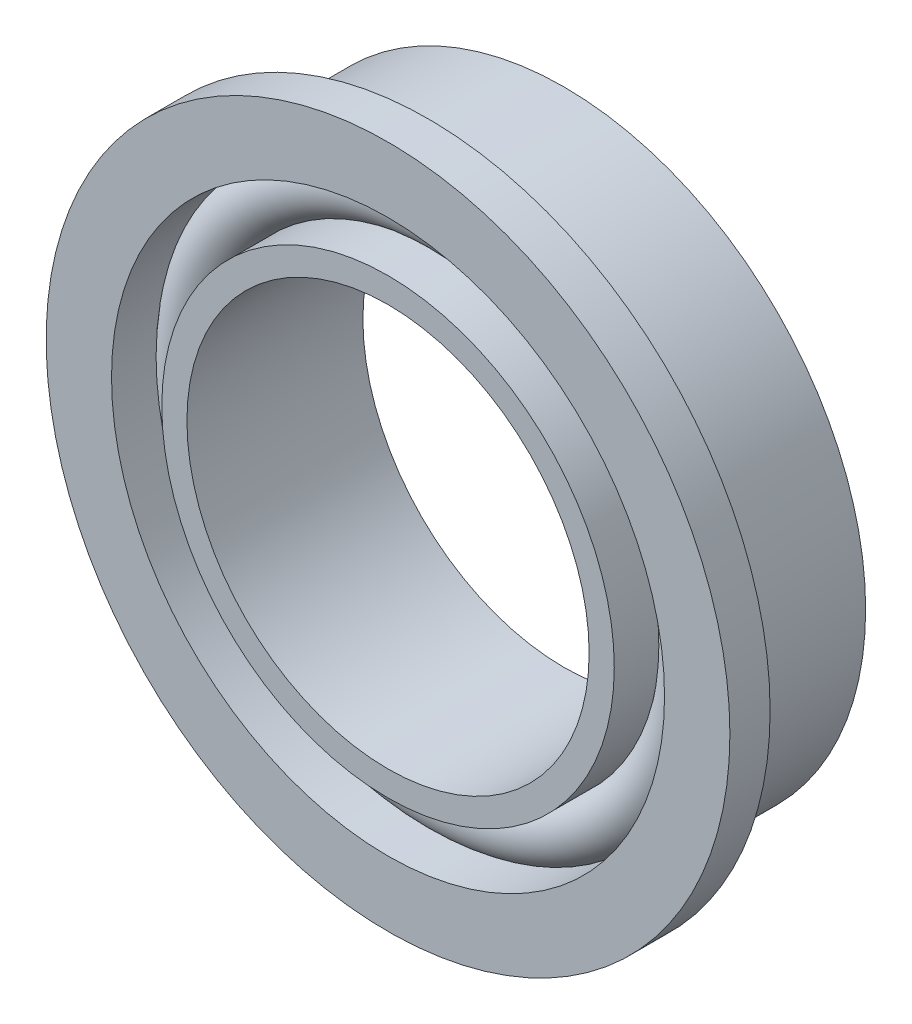
ISO-10303-21;
HEADER;
FILE_DESCRIPTION(('STEP AP214'),'2;1');
FILE_NAME('part.step','',(''),(''),'','','');
FILE_SCHEMA(('AUTOMOTIVE_DESIGN { 1 0 10303 214 1 1 1 1 }'));
ENDSEC;
DATA;
#1=APPLICATION_CONTEXT('core data for automotive mechanical design processes');
#2=APPLICATION_PROTOCOL_DEFINITION('international standard','automotive_design',2000,#1);
#3=PRODUCT_CONTEXT('',#1,'mechanical');
#4=PRODUCT('Part','Part','',(#3));
#5=PRODUCT_RELATED_PRODUCT_CATEGORY('part','',(#4));
#6=PRODUCT_DEFINITION_FORMATION('','',#4);
#7=PRODUCT_DEFINITION_CONTEXT('part definition',#1,'design');
#8=PRODUCT_DEFINITION('design','',#6,#7);
#9=PRODUCT_DEFINITION_SHAPE('','',#8);
#10=(LENGTH_UNIT() NAMED_UNIT(*) SI_UNIT(.MILLI.,.METRE.));
#11=(NAMED_UNIT(*) PLANE_ANGLE_UNIT() SI_UNIT($,.RADIAN.));
#12=(NAMED_UNIT(*) SI_UNIT($,.STERADIAN.) SOLID_ANGLE_UNIT());
#13=UNCERTAINTY_MEASURE_WITH_UNIT(LENGTH_MEASURE(1.E-05),#10,'distance_accuracy_value','');
#14=(GEOMETRIC_REPRESENTATION_CONTEXT(3) GLOBAL_UNCERTAINTY_ASSIGNED_CONTEXT((#13)) GLOBAL_UNIT_ASSIGNED_CONTEXT((#10,
#11,#12)) REPRESENTATION_CONTEXT('',''));
#15=CARTESIAN_POINT('',(0.,0.,0.));
#16=DIRECTION('',(0.,0.,1.));
#17=DIRECTION('',(1.,0.,0.));
#18=AXIS2_PLACEMENT_3D('',#15,#16,#17);
#19=CARTESIAN_POINT('',(0.,0.,3.5));
#20=DIRECTION('',(0.,0.,-1.));
#21=DIRECTION('',(-1.,0.,0.));
#22=AXIS2_PLACEMENT_3D('',#19,#20,#21);
#23=CYLINDRICAL_SURFACE('',#22,6.);
#24=CARTESIAN_POINT('',(0.,0.,0.));
#25=DIRECTION('',(0.,0.,1.));
#26=DIRECTION('',(1.,0.,0.));
#27=AXIS2_PLACEMENT_3D('',#24,#25,#26);
#28=CIRCLE('',#27,6.);
#29=CARTESIAN_POINT('',(6.,0.,0.));
#30=VERTEX_POINT('',#29);
#31=EDGE_CURVE('E63',#30,#30,#28,.T.);
#32=ORIENTED_EDGE('',*,*,#31,.T.);
#33=EDGE_LOOP('',(#32));
#34=FACE_BOUND('',#33,.T.);
#35=CARTESIAN_POINT('',(0.,0.,2.7));
#36=DIRECTION('',(0.,0.,1.));
#37=DIRECTION('',(1.,0.,0.));
#38=AXIS2_PLACEMENT_3D('',#35,#36,#37);
#39=CIRCLE('',#38,6.);
#40=CARTESIAN_POINT('',(6.,0.,2.7));
#41=VERTEX_POINT('',#40);
#42=EDGE_CURVE('E10',#41,#41,#39,.T.);
#43=ORIENTED_EDGE('',*,*,#42,.F.);
#44=EDGE_LOOP('',(#43));
#45=FACE_BOUND('',#44,.T.);
#46=ADVANCED_FACE('F34',(#34,#45),#23,.T.);
#47=CARTESIAN_POINT('',(0.,0.,2.26526514094346));
#48=DIRECTION('',(0.,0.,1.));
#49=DIRECTION('',(1.,0.,0.));
#50=AXIS2_PLACEMENT_3D('',#47,#48,#49);
#51=TOROIDAL_SURFACE('',#50,5.,0.6);
#52=CARTESIAN_POINT('',(0.,0.,2.596927619979));
#53=DIRECTION('',(0.,0.,-1.));
#54=DIRECTION('',(-1.,0.,0.));
#55=AXIS2_PLACEMENT_3D('',#52,#53,#54);
#56=CIRCLE('',#55,4.5);
#57=CARTESIAN_POINT('',(-4.5,0.,2.596927619979));
#58=VERTEX_POINT('',#57);
#59=EDGE_CURVE('E56',#58,#58,#56,.T.);
#60=ORIENTED_EDGE('',*,*,#59,.T.);
#61=EDGE_LOOP('',(#60));
#62=FACE_BOUND('',#61,.T.);
#63=CARTESIAN_POINT('',(0.,0.,2.596927619979));
#64=DIRECTION('',(0.,0.,-1.));
#65=DIRECTION('',(-1.,0.,0.));
#66=AXIS2_PLACEMENT_3D('',#63,#64,#65);
#67=CIRCLE('',#66,5.5);
#68=CARTESIAN_POINT('',(-5.5,0.,2.596927619979));
#69=VERTEX_POINT('',#68);
#70=EDGE_CURVE('E41',#69,#69,#67,.F.);
#71=ORIENTED_EDGE('',*,*,#70,.T.);
#72=EDGE_LOOP('',(#71));
#73=FACE_BOUND('',#72,.T.);
#74=ADVANCED_FACE('F123',(#62,#73),#51,.T.);
#75=CARTESIAN_POINT('',(0.,0.,-37.6));
#76=DIRECTION('',(0.,0.,1.));
#77=DIRECTION('',(1.,0.,0.));
#78=AXIS2_PLACEMENT_3D('',#75,#76,#77);
#79=CYLINDRICAL_SURFACE('',#78,5.5);
#80=CARTESIAN_POINT('',(0.,0.,3.5));
#81=DIRECTION('',(0.,0.,1.));
#82=DIRECTION('',(1.,0.,0.));
#83=AXIS2_PLACEMENT_3D('',#80,#81,#82);
#84=CIRCLE('',#83,5.5);
#85=CARTESIAN_POINT('',(5.5,0.,3.5));
#86=VERTEX_POINT('',#85);
#87=EDGE_CURVE('E50',#86,#86,#84,.T.);
#88=ORIENTED_EDGE('',*,*,#87,.T.);
#89=EDGE_LOOP('',(#88));
#90=FACE_BOUND('',#89,.T.);
#91=ORIENTED_EDGE('',*,*,#70,.F.);
#92=EDGE_LOOP('',(#91));
#93=FACE_BOUND('',#92,.T.);
#94=ADVANCED_FACE('F75',(#90,#93),#79,.F.);
#95=CARTESIAN_POINT('',(0.,0.,0.));
#96=DIRECTION('',(0.,0.,1.));
#97=DIRECTION('',(1.,0.,0.));
#98=AXIS2_PLACEMENT_3D('',#95,#96,#97);
#99=CIRCLE('',#98,5.5);
#100=CARTESIAN_POINT('',(5.5,0.,0.));
#101=VERTEX_POINT('',#100);
#102=EDGE_CURVE('E59',#101,#101,#99,.T.);
#103=ORIENTED_EDGE('',*,*,#102,.F.);
#104=EDGE_LOOP('',(#103));
#105=FACE_BOUND('',#104,.T.);
#106=CARTESIAN_POINT('',(0.,0.,1.93360266190792));
#107=DIRECTION('',(0.,0.,1.));
#108=DIRECTION('',(1.,0.,0.));
#109=AXIS2_PLACEMENT_3D('',#106,#107,#108);
#110=CIRCLE('',#109,5.5);
#111=CARTESIAN_POINT('',(5.5,0.,1.93360266190793));
#112=VERTEX_POINT('',#111);
#113=EDGE_CURVE('E45',#112,#112,#110,.F.);
#114=ORIENTED_EDGE('',*,*,#113,.F.);
#115=EDGE_LOOP('',(#114));
#116=FACE_BOUND('',#115,.T.);
#117=ADVANCED_FACE('F81',(#105,#116),#79,.F.);
#118=CARTESIAN_POINT('',(0.,0.,3.5));
#119=DIRECTION('',(0.,0.,1.));
#120=DIRECTION('',(1.,0.,0.));
#121=AXIS2_PLACEMENT_3D('',#118,#119,#120);
#122=PLANE('',#121);
#123=ORIENTED_EDGE('',*,*,#87,.F.);
#124=EDGE_LOOP('',(#123));
#125=FACE_BOUND('',#124,.T.);
#126=CARTESIAN_POINT('',(0.,0.,3.5));
#127=DIRECTION('',(0.,0.,1.));
#128=DIRECTION('',(1.,0.,0.));
#129=AXIS2_PLACEMENT_3D('',#126,#127,#128);
#130=CIRCLE('',#129,6.8);
#131=CARTESIAN_POINT('',(6.8,0.,3.50000000000001));
#132=VERTEX_POINT('',#131);
#133=EDGE_CURVE('E84',#132,#132,#130,.T.);
#134=ORIENTED_EDGE('',*,*,#133,.T.);
#135=EDGE_LOOP('',(#134));
#136=FACE_BOUND('',#135,.T.);
#137=ADVANCED_FACE('F78',(#125,#136),#122,.T.);
#138=CARTESIAN_POINT('',(0.,0.,0.));
#139=DIRECTION('',(0.,0.,1.));
#140=DIRECTION('',(1.,0.,0.));
#141=AXIS2_PLACEMENT_3D('',#138,#139,#140);
#142=PLANE('',#141);
#143=ORIENTED_EDGE('',*,*,#102,.T.);
#144=EDGE_LOOP('',(#143));
#145=FACE_BOUND('',#144,.T.);
#146=ORIENTED_EDGE('',*,*,#31,.F.);
#147=EDGE_LOOP('',(#146));
#148=FACE_BOUND('',#147,.T.);
#149=ADVANCED_FACE('F36',(#145,#148),#142,.F.);
#150=CARTESIAN_POINT('',(0.,0.,1.93360266190792));
#151=DIRECTION('',(0.,0.,1.));
#152=DIRECTION('',(1.,0.,0.));
#153=AXIS2_PLACEMENT_3D('',#150,#151,#152);
#154=CIRCLE('',#153,4.5);
#155=CARTESIAN_POINT('',(4.5,0.,1.93360266190793));
#156=VERTEX_POINT('',#155);
#157=EDGE_CURVE('E54',#156,#156,#154,.T.);
#158=ORIENTED_EDGE('',*,*,#157,.T.);
#159=EDGE_LOOP('',(#158));
#160=FACE_BOUND('',#159,.T.);
#161=ORIENTED_EDGE('',*,*,#113,.T.);
#162=EDGE_LOOP('',(#161));
#163=FACE_BOUND('',#162,.T.);
#164=ADVANCED_FACE('F129',(#160,#163),#51,.T.);
#165=CARTESIAN_POINT('',(0.,0.,-37.6));
#166=DIRECTION('',(0.,0.,1.));
#167=DIRECTION('',(1.,0.,0.));
#168=AXIS2_PLACEMENT_3D('',#165,#166,#167);
#169=CYLINDRICAL_SURFACE('',#168,4.5);
#170=CARTESIAN_POINT('',(0.,0.,3.5));
#171=DIRECTION('',(0.,0.,1.));
#172=DIRECTION('',(1.,0.,0.));
#173=AXIS2_PLACEMENT_3D('',#170,#171,#172);
#174=CIRCLE('',#173,4.5);
#175=CARTESIAN_POINT('',(4.5,0.,3.5));
#176=VERTEX_POINT('',#175);
#177=EDGE_CURVE('E89',#176,#176,#174,.T.);
#178=ORIENTED_EDGE('',*,*,#177,.F.);
#179=EDGE_LOOP('',(#178));
#180=FACE_BOUND('',#179,.T.);
#181=ORIENTED_EDGE('',*,*,#59,.F.);
#182=EDGE_LOOP('',(#181));
#183=FACE_BOUND('',#182,.T.);
#184=ADVANCED_FACE('F143',(#180,#183),#169,.T.);
#185=CARTESIAN_POINT('',(0.,0.,0.));
#186=DIRECTION('',(0.,0.,1.));
#187=DIRECTION('',(1.,0.,0.));
#188=AXIS2_PLACEMENT_3D('',#185,#186,#187);
#189=CIRCLE('',#188,4.5);
#190=CARTESIAN_POINT('',(4.5,0.,0.));
#191=VERTEX_POINT('',#190);
#192=EDGE_CURVE('E70',#191,#191,#189,.T.);
#193=ORIENTED_EDGE('',*,*,#192,.T.);
#194=EDGE_LOOP('',(#193));
#195=FACE_BOUND('',#194,.T.);
#196=ORIENTED_EDGE('',*,*,#157,.F.);
#197=EDGE_LOOP('',(#196));
#198=FACE_BOUND('',#197,.T.);
#199=ADVANCED_FACE('F102',(#195,#198),#169,.T.);
#200=CARTESIAN_POINT('',(0.,0.,3.5));
#201=DIRECTION('',(0.,0.,1.));
#202=DIRECTION('',(1.,0.,0.));
#203=AXIS2_PLACEMENT_3D('',#200,#201,#202);
#204=PLANE('',#203);
#205=CARTESIAN_POINT('',(0.,0.,3.5));
#206=DIRECTION('',(0.,0.,1.));
#207=DIRECTION('',(1.,0.,0.));
#208=AXIS2_PLACEMENT_3D('',#205,#206,#207);
#209=CIRCLE('',#208,4.);
#210=CARTESIAN_POINT('',(4.,0.,3.5));
#211=VERTEX_POINT('',#210);
#212=EDGE_CURVE('E57',#211,#211,#209,.T.);
#213=ORIENTED_EDGE('',*,*,#212,.F.);
#214=EDGE_LOOP('',(#213));
#215=FACE_BOUND('',#214,.T.);
#216=ORIENTED_EDGE('',*,*,#177,.T.);
#217=EDGE_LOOP('',(#216));
#218=FACE_BOUND('',#217,.T.);
#219=ADVANCED_FACE('F117',(#215,#218),#204,.T.);
#220=CARTESIAN_POINT('',(0.,0.,3.5));
#221=DIRECTION('',(0.,0.,-1.));
#222=DIRECTION('',(-1.,0.,0.));
#223=AXIS2_PLACEMENT_3D('',#220,#221,#222);
#224=CYLINDRICAL_SURFACE('',#223,4.);
#225=ORIENTED_EDGE('',*,*,#212,.T.);
#226=EDGE_LOOP('',(#225));
#227=FACE_BOUND('',#226,.T.);
#228=CARTESIAN_POINT('',(0.,0.,0.));
#229=DIRECTION('',(0.,0.,1.));
#230=DIRECTION('',(1.,0.,0.));
#231=AXIS2_PLACEMENT_3D('',#228,#229,#230);
#232=CIRCLE('',#231,4.);
#233=CARTESIAN_POINT('',(4.,0.,0.));
#234=VERTEX_POINT('',#233);
#235=EDGE_CURVE('E95',#234,#234,#232,.T.);
#236=ORIENTED_EDGE('',*,*,#235,.F.);
#237=EDGE_LOOP('',(#236));
#238=FACE_BOUND('',#237,.T.);
#239=ADVANCED_FACE('F108',(#227,#238),#224,.F.);
#240=CARTESIAN_POINT('',(0.,0.,0.));
#241=DIRECTION('',(0.,0.,1.));
#242=DIRECTION('',(1.,0.,0.));
#243=AXIS2_PLACEMENT_3D('',#240,#241,#242);
#244=PLANE('',#243);
#245=ORIENTED_EDGE('',*,*,#235,.T.);
#246=EDGE_LOOP('',(#245));
#247=FACE_BOUND('',#246,.T.);
#248=ORIENTED_EDGE('',*,*,#192,.F.);
#249=EDGE_LOOP('',(#248));
#250=FACE_BOUND('',#249,.T.);
#251=ADVANCED_FACE('F105',(#247,#250),#244,.F.);
#252=CARTESIAN_POINT('',(0.,0.,2.7));
#253=DIRECTION('',(0.,0.,1.));
#254=DIRECTION('',(1.,0.,0.));
#255=AXIS2_PLACEMENT_3D('',#252,#253,#254);
#256=CYLINDRICAL_SURFACE('',#255,6.8);
#257=CARTESIAN_POINT('',(0.,0.,2.7));
#258=DIRECTION('',(0.,0.,1.));
#259=DIRECTION('',(1.,0.,0.));
#260=AXIS2_PLACEMENT_3D('',#257,#258,#259);
#261=CIRCLE('',#260,6.8);
#262=CARTESIAN_POINT('',(6.8,0.,2.7));
#263=VERTEX_POINT('',#262);
#264=EDGE_CURVE('E86',#263,#263,#261,.T.);
#265=ORIENTED_EDGE('',*,*,#264,.T.);
#266=EDGE_LOOP('',(#265));
#267=FACE_BOUND('',#266,.T.);
#268=ORIENTED_EDGE('',*,*,#133,.F.);
#269=EDGE_LOOP('',(#268));
#270=FACE_BOUND('',#269,.T.);
#271=ADVANCED_FACE('F107',(#267,#270),#256,.T.);
#272=CARTESIAN_POINT('',(0.,0.,2.7));
#273=DIRECTION('',(0.,0.,1.));
#274=DIRECTION('',(1.,0.,0.));
#275=AXIS2_PLACEMENT_3D('',#272,#273,#274);
#276=PLANE('',#275);
#277=ORIENTED_EDGE('',*,*,#42,.T.);
#278=EDGE_LOOP('',(#277));
#279=FACE_BOUND('',#278,.T.);
#280=ORIENTED_EDGE('',*,*,#264,.F.);
#281=EDGE_LOOP('',(#280));
#282=FACE_BOUND('',#281,.T.);
#283=ADVANCED_FACE('F114',(#279,#282),#276,.F.);
#284=CLOSED_SHELL('',(#46,#74,#94,#117,#137,#149,#164,#184,#199,#219,#239,#251,#271,#283));
#285=MANIFOLD_SOLID_BREP('B2',#284);
#286=ADVANCED_BREP_SHAPE_REPRESENTATION('',(#18,#285),#14);
#287=SHAPE_DEFINITION_REPRESENTATION(#9,#286);
ENDSEC;
END-ISO-10303-21;
